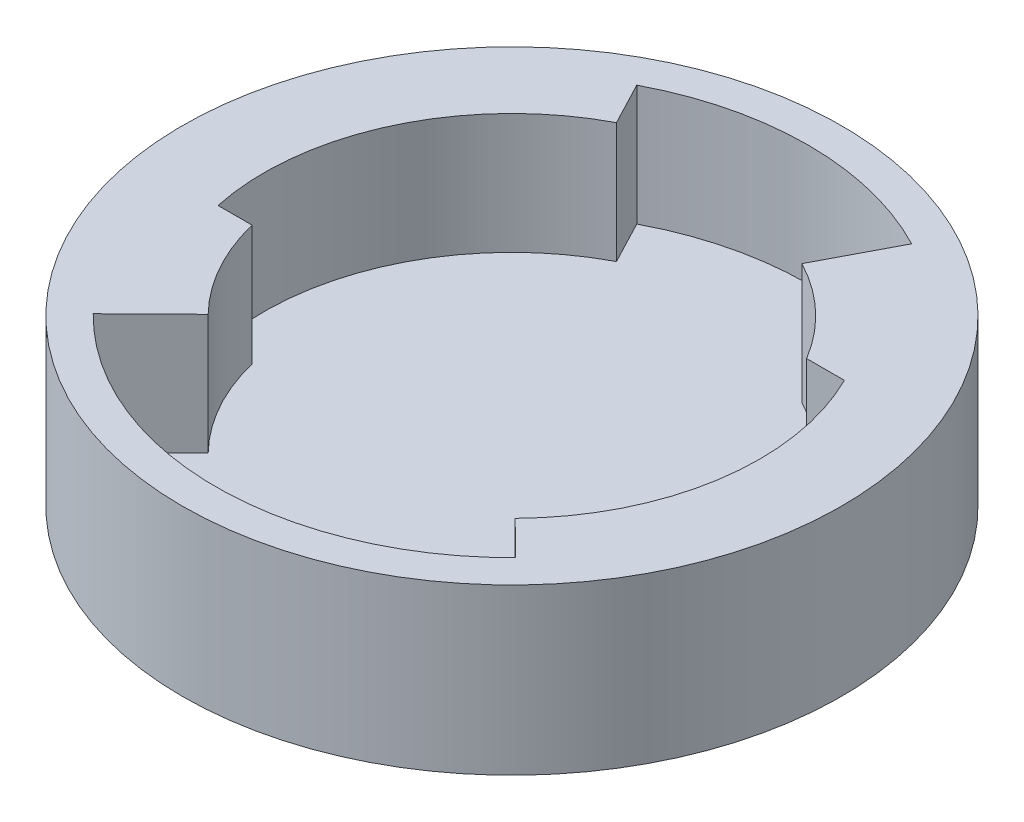
ISO-10303-21;
HEADER;
FILE_DESCRIPTION(('STEP AP214'),'2;1');
FILE_NAME('part.step','',(''),(''),'','','');
FILE_SCHEMA(('AUTOMOTIVE_DESIGN { 1 0 10303 214 1 1 1 1 }'));
ENDSEC;
DATA;
#1=APPLICATION_CONTEXT('core data for automotive mechanical design processes');
#2=APPLICATION_PROTOCOL_DEFINITION('international standard','automotive_design',2000,#1);
#3=PRODUCT_CONTEXT('',#1,'mechanical');
#4=PRODUCT('Part','Part','',(#3));
#5=PRODUCT_RELATED_PRODUCT_CATEGORY('part','',(#4));
#6=PRODUCT_DEFINITION_FORMATION('','',#4);
#7=PRODUCT_DEFINITION_CONTEXT('part definition',#1,'design');
#8=PRODUCT_DEFINITION('design','',#6,#7);
#9=PRODUCT_DEFINITION_SHAPE('','',#8);
#10=(LENGTH_UNIT() NAMED_UNIT(*) SI_UNIT(.MILLI.,.METRE.));
#11=(NAMED_UNIT(*) PLANE_ANGLE_UNIT() SI_UNIT($,.RADIAN.));
#12=(NAMED_UNIT(*) SI_UNIT($,.STERADIAN.) SOLID_ANGLE_UNIT());
#13=UNCERTAINTY_MEASURE_WITH_UNIT(LENGTH_MEASURE(1.E-05),#10,'distance_accuracy_value','');
#14=(GEOMETRIC_REPRESENTATION_CONTEXT(3) GLOBAL_UNCERTAINTY_ASSIGNED_CONTEXT((#13)) GLOBAL_UNIT_ASSIGNED_CONTEXT((#10,
#11,#12)) REPRESENTATION_CONTEXT('',''));
#15=CARTESIAN_POINT('',(0.,0.,0.));
#16=DIRECTION('',(0.,0.,1.));
#17=DIRECTION('',(1.,0.,0.));
#18=AXIS2_PLACEMENT_3D('',#15,#16,#17);
#19=CARTESIAN_POINT('',(0.,-25.,0.));
#20=DIRECTION('',(0.,1.,0.));
#21=DIRECTION('',(0.,0.,1.));
#22=AXIS2_PLACEMENT_3D('',#19,#20,#21);
#23=CYLINDRICAL_SURFACE('',#22,50.);
#24=CARTESIAN_POINT('',(0.,-25.,0.));
#25=DIRECTION('',(0.,1.,0.));
#26=DIRECTION('',(0.,0.,1.));
#27=AXIS2_PLACEMENT_3D('',#24,#25,#26);
#28=CIRCLE('',#27,50.);
#29=CARTESIAN_POINT('',(0.,-25.,50.));
#30=VERTEX_POINT('',#29);
#31=EDGE_CURVE('E11',#30,#30,#28,.T.);
#32=ORIENTED_EDGE('',*,*,#31,.T.);
#33=EDGE_LOOP('',(#32));
#34=FACE_BOUND('',#33,.T.);
#35=CARTESIAN_POINT('',(0.,0.,0.));
#36=DIRECTION('',(0.,1.,0.));
#37=DIRECTION('',(0.,0.,1.));
#38=AXIS2_PLACEMENT_3D('',#35,#36,#37);
#39=CIRCLE('',#38,50.);
#40=CARTESIAN_POINT('',(0.,0.,50.));
#41=VERTEX_POINT('',#40);
#42=EDGE_CURVE('E40',#41,#41,#39,.T.);
#43=ORIENTED_EDGE('',*,*,#42,.F.);
#44=EDGE_LOOP('',(#43));
#45=FACE_BOUND('',#44,.T.);
#46=ADVANCED_FACE('F37',(#34,#45),#23,.T.);
#47=CARTESIAN_POINT('',(0.,-25.,0.));
#48=DIRECTION('',(0.,1.,0.));
#49=DIRECTION('',(0.,0.,1.));
#50=AXIS2_PLACEMENT_3D('',#47,#48,#49);
#51=PLANE('',#50);
#52=ORIENTED_EDGE('',*,*,#31,.F.);
#53=EDGE_LOOP('',(#52));
#54=FACE_BOUND('',#53,.T.);
#55=ADVANCED_FACE('F261',(#54),#51,.F.);
#56=CARTESIAN_POINT('',(0.,0.,0.));
#57=DIRECTION('',(0.,1.,0.));
#58=DIRECTION('',(0.,0.,1.));
#59=AXIS2_PLACEMENT_3D('',#56,#57,#58);
#60=PLANE('',#59);
#61=CARTESIAN_POINT('',(0.,0.,0.));
#62=DIRECTION('',(0.,1.,0.));
#63=DIRECTION('',(0.,0.,-1.));
#64=AXIS2_PLACEMENT_3D('',#61,#62,#63);
#65=CIRCLE('',#64,44.92);
#66=CARTESIAN_POINT('',(20.85,0.,-39.7879868804643));
#67=VERTEX_POINT('',#66);
#68=CARTESIAN_POINT('',(-20.85,0.,-39.7879868804643));
#69=VERTEX_POINT('',#68);
#70=EDGE_CURVE('E51',#67,#69,#65,.T.);
#71=ORIENTED_EDGE('',*,*,#70,.F.);
#72=DIRECTION('',(0.464158504007124,0.,-0.885752156733399));
#73=VECTOR('',#72,1.);
#74=CARTESIAN_POINT('',(20.85,0.,-39.7879868804643));
#75=LINE('',#74,#73);
#76=CARTESIAN_POINT('',(15.1265545049854,0.,-28.8659545415342));
#77=VERTEX_POINT('',#76);
#78=EDGE_CURVE('E188',#77,#67,#75,.T.);
#79=ORIENTED_EDGE('',*,*,#78,.F.);
#80=CARTESIAN_POINT('',(0.,0.,0.));
#81=DIRECTION('',(0.,1.,0.));
#82=DIRECTION('',(0.,0.,-1.));
#83=AXIS2_PLACEMENT_3D('',#80,#81,#82);
#84=CIRCLE('',#83,32.5892004011485);
#85=CARTESIAN_POINT('',(27.9544244429238,0.,-16.7513025419243));
#86=VERTEX_POINT('',#85);
#87=EDGE_CURVE('E186',#86,#77,#84,.T.);
#88=ORIENTED_EDGE('',*,*,#87,.F.);
#89=DIRECTION('',(-1.,0.,0.));
#90=VECTOR('',#89,1.);
#91=CARTESIAN_POINT('',(27.9544244429238,0.,-16.7513025419243));
#92=LINE('',#91,#90);
#93=CARTESIAN_POINT('',(33.6846888533785,0.,-16.7513025419243));
#94=VERTEX_POINT('',#93);
#95=EDGE_CURVE('E135',#94,#86,#92,.T.);
#96=ORIENTED_EDGE('',*,*,#95,.F.);
#97=CARTESIAN_POINT('',(0.,0.,0.));
#98=DIRECTION('',(0.,1.,0.));
#99=DIRECTION('',(0.,0.,1.));
#100=AXIS2_PLACEMENT_3D('',#97,#98,#99);
#101=CIRCLE('',#100,37.62);
#102=CARTESIAN_POINT('',(26.841518254675,0.,26.3590079059124));
#103=VERTEX_POINT('',#102);
#104=EDGE_CURVE('E182',#103,#94,#101,.T.);
#105=ORIENTED_EDGE('',*,*,#104,.F.);
#106=DIRECTION('',(-0.713490650044523,0.,-0.700664750290068));
#107=VECTOR('',#106,1.);
#108=CARTESIAN_POINT('',(32.05,0.,31.4738605830299));
#109=LINE('',#108,#107);
#110=CARTESIAN_POINT('',(32.05,0.,31.4738605830299));
#111=VERTEX_POINT('',#110);
#112=EDGE_CURVE('E179',#111,#103,#109,.T.);
#113=ORIENTED_EDGE('',*,*,#112,.F.);
#114=CARTESIAN_POINT('',(0.,0.,0.));
#115=DIRECTION('',(0.,1.,0.));
#116=DIRECTION('',(0.,0.,-1.));
#117=AXIS2_PLACEMENT_3D('',#114,#115,#116);
#118=CIRCLE('',#117,44.92);
#119=CARTESIAN_POINT('',(-32.05,0.,31.4738605830299));
#120=VERTEX_POINT('',#119);
#121=EDGE_CURVE('E176',#120,#111,#118,.T.);
#122=ORIENTED_EDGE('',*,*,#121,.F.);
#123=DIRECTION('',(-0.713490650044523,0.,0.700664750290068));
#124=VECTOR('',#123,1.);
#125=CARTESIAN_POINT('',(-32.05,0.,31.4738605830299));
#126=LINE('',#125,#124);
#127=CARTESIAN_POINT('',(-23.2520897786466,0.,22.8341039612237));
#128=VERTEX_POINT('',#127);
#129=EDGE_CURVE('E173',#128,#120,#126,.T.);
#130=ORIENTED_EDGE('',*,*,#129,.F.);
#131=CARTESIAN_POINT('',(6.31786289950753E-12,0.,-3.52669282666085E-12));
#132=DIRECTION('',(0.,1.,0.));
#133=DIRECTION('',(0.,0.,-1.));
#134=AXIS2_PLACEMENT_3D('',#131,#132,#133);
#135=CIRCLE('',#134,32.5892004011554);
#136=CARTESIAN_POINT('',(-31.6453479378877,0.,7.78639433089828));
#137=VERTEX_POINT('',#136);
#138=EDGE_CURVE('E170',#137,#128,#135,.T.);
#139=ORIENTED_EDGE('',*,*,#138,.F.);
#140=DIRECTION('',(1.,0.,0.));
#141=VECTOR('',#140,1.);
#142=CARTESIAN_POINT('',(-36.8053863357492,0.,7.78639433089828));
#143=LINE('',#142,#141);
#144=CARTESIAN_POINT('',(-36.8053863357492,0.,7.78639433089827));
#145=VERTEX_POINT('',#144);
#146=EDGE_CURVE('E167',#145,#137,#143,.T.);
#147=ORIENTED_EDGE('',*,*,#146,.F.);
#148=CARTESIAN_POINT('',(0.,0.,0.));
#149=DIRECTION('',(0.,1.,0.));
#150=DIRECTION('',(0.,0.,1.));
#151=AXIS2_PLACEMENT_3D('',#148,#149,#150);
#152=CIRCLE('',#151,37.62);
#153=CARTESIAN_POINT('',(-17.461642920748,0.,-33.3219961363105));
#154=VERTEX_POINT('',#153);
#155=EDGE_CURVE('E164',#154,#145,#152,.T.);
#156=ORIENTED_EDGE('',*,*,#155,.F.);
#157=DIRECTION('',(0.464158504007124,0.,0.8857521567334));
#158=VECTOR('',#157,1.);
#159=CARTESIAN_POINT('',(-20.85,0.,-39.7879868804643));
#160=LINE('',#159,#158);
#161=EDGE_CURVE('E161',#69,#154,#160,.T.);
#162=ORIENTED_EDGE('',*,*,#161,.F.);
#163=EDGE_LOOP('',(#71,#79,#88,#96,#105,#113,#122,#130,#139,#147,#156,#162));
#164=FACE_BOUND('',#163,.T.);
#165=ORIENTED_EDGE('',*,*,#42,.T.);
#166=EDGE_LOOP('',(#165));
#167=FACE_BOUND('',#166,.T.);
#168=ADVANCED_FACE('F215',(#164,#167),#60,.T.);
#169=CARTESIAN_POINT('',(0.,-18.25,0.));
#170=DIRECTION('',(0.,1.,0.));
#171=DIRECTION('',(0.,0.,1.));
#172=AXIS2_PLACEMENT_3D('',#169,#170,#171);
#173=CYLINDRICAL_SURFACE('',#172,44.92);
#174=ORIENTED_EDGE('',*,*,#70,.T.);
#175=DIRECTION('',(0.,1.,0.));
#176=VECTOR('',#175,1.);
#177=CARTESIAN_POINT('',(-20.85,-18.25,-39.7879868804643));
#178=LINE('',#177,#176);
#179=CARTESIAN_POINT('',(-20.85,-18.25,-39.7879868804643));
#180=VERTEX_POINT('',#179);
#181=EDGE_CURVE('E99',#180,#69,#178,.T.);
#182=ORIENTED_EDGE('',*,*,#181,.F.);
#183=CARTESIAN_POINT('',(0.,-18.25,0.));
#184=DIRECTION('',(0.,1.,0.));
#185=DIRECTION('',(0.,0.,-1.));
#186=AXIS2_PLACEMENT_3D('',#183,#184,#185);
#187=CIRCLE('',#186,44.92);
#188=CARTESIAN_POINT('',(20.85,-18.25,-39.7879868804643));
#189=VERTEX_POINT('',#188);
#190=EDGE_CURVE('E190',#189,#180,#187,.T.);
#191=ORIENTED_EDGE('',*,*,#190,.F.);
#192=DIRECTION('',(0.,1.,0.));
#193=VECTOR('',#192,1.);
#194=CARTESIAN_POINT('',(20.85,-18.25,-39.7879868804643));
#195=LINE('',#194,#193);
#196=EDGE_CURVE('E59',#189,#67,#195,.T.);
#197=ORIENTED_EDGE('',*,*,#196,.T.);
#198=EDGE_LOOP('',(#174,#182,#191,#197));
#199=FACE_BOUND('',#198,.T.);
#200=ADVANCED_FACE('F251',(#199),#173,.F.);
#201=CARTESIAN_POINT('',(20.85,-18.25,-39.7879868804643));
#202=DIRECTION('',(0.885752156733399,0.,0.464158504007124));
#203=DIRECTION('',(0.464158504007124,0.,-0.885752156733399));
#204=AXIS2_PLACEMENT_3D('',#201,#202,#203);
#205=PLANE('',#204);
#206=ORIENTED_EDGE('',*,*,#78,.T.);
#207=ORIENTED_EDGE('',*,*,#196,.F.);
#208=DIRECTION('',(0.464158504007124,0.,-0.885752156733399));
#209=VECTOR('',#208,1.);
#210=CARTESIAN_POINT('',(20.85,-18.25,-39.7879868804643));
#211=LINE('',#210,#209);
#212=CARTESIAN_POINT('',(15.1265545049854,-18.25,-28.8659545415342));
#213=VERTEX_POINT('',#212);
#214=EDGE_CURVE('E147',#213,#189,#211,.T.);
#215=ORIENTED_EDGE('',*,*,#214,.F.);
#216=DIRECTION('',(0.,1.,0.));
#217=VECTOR('',#216,1.);
#218=CARTESIAN_POINT('',(15.1265545049854,-18.25,-28.8659545415342));
#219=LINE('',#218,#217);
#220=EDGE_CURVE('E139',#213,#77,#219,.T.);
#221=ORIENTED_EDGE('',*,*,#220,.T.);
#222=EDGE_LOOP('',(#206,#207,#215,#221));
#223=FACE_BOUND('',#222,.T.);
#224=ADVANCED_FACE('F249',(#223),#205,.F.);
#225=CARTESIAN_POINT('',(0.,-18.25,0.));
#226=DIRECTION('',(0.,1.,0.));
#227=DIRECTION('',(0.,0.,1.));
#228=AXIS2_PLACEMENT_3D('',#225,#226,#227);
#229=CYLINDRICAL_SURFACE('',#228,32.5892004011485);
#230=ORIENTED_EDGE('',*,*,#87,.T.);
#231=ORIENTED_EDGE('',*,*,#220,.F.);
#232=CARTESIAN_POINT('',(0.,-18.25,0.));
#233=DIRECTION('',(0.,1.,0.));
#234=DIRECTION('',(0.,0.,-1.));
#235=AXIS2_PLACEMENT_3D('',#232,#233,#234);
#236=CIRCLE('',#235,32.5892004011485);
#237=CARTESIAN_POINT('',(27.9544244429238,-18.25,-16.7513025419243));
#238=VERTEX_POINT('',#237);
#239=EDGE_CURVE('E143',#238,#213,#236,.T.);
#240=ORIENTED_EDGE('',*,*,#239,.F.);
#241=DIRECTION('',(0.,1.,0.));
#242=VECTOR('',#241,1.);
#243=CARTESIAN_POINT('',(27.9544244429238,-18.25,-16.7513025419243));
#244=LINE('',#243,#242);
#245=EDGE_CURVE('E128',#238,#86,#244,.T.);
#246=ORIENTED_EDGE('',*,*,#245,.T.);
#247=EDGE_LOOP('',(#230,#231,#240,#246));
#248=FACE_BOUND('',#247,.T.);
#249=ADVANCED_FACE('F144',(#248),#229,.F.);
#250=CARTESIAN_POINT('',(27.9544244429238,-18.25,-16.7513025419243));
#251=DIRECTION('',(0.,0.,-1.));
#252=DIRECTION('',(-1.,0.,0.));
#253=AXIS2_PLACEMENT_3D('',#250,#251,#252);
#254=PLANE('',#253);
#255=ORIENTED_EDGE('',*,*,#95,.T.);
#256=ORIENTED_EDGE('',*,*,#245,.F.);
#257=DIRECTION('',(-1.,0.,0.));
#258=VECTOR('',#257,1.);
#259=CARTESIAN_POINT('',(27.9544244429238,-18.25,-16.7513025419243));
#260=LINE('',#259,#258);
#261=CARTESIAN_POINT('',(33.6846888533785,-18.25,-16.7513025419243));
#262=VERTEX_POINT('',#261);
#263=EDGE_CURVE('E132',#262,#238,#260,.T.);
#264=ORIENTED_EDGE('',*,*,#263,.F.);
#265=DIRECTION('',(0.,1.,0.));
#266=VECTOR('',#265,1.);
#267=CARTESIAN_POINT('',(33.6846888533785,-18.25,-16.7513025419243));
#268=LINE('',#267,#266);
#269=EDGE_CURVE('E140',#262,#94,#268,.T.);
#270=ORIENTED_EDGE('',*,*,#269,.T.);
#271=EDGE_LOOP('',(#255,#256,#264,#270));
#272=FACE_BOUND('',#271,.T.);
#273=ADVANCED_FACE('F130',(#272),#254,.F.);
#274=CARTESIAN_POINT('',(0.,-18.25,0.));
#275=DIRECTION('',(0.,1.,0.));
#276=DIRECTION('',(0.,0.,1.));
#277=AXIS2_PLACEMENT_3D('',#274,#275,#276);
#278=CYLINDRICAL_SURFACE('',#277,37.62);
#279=ORIENTED_EDGE('',*,*,#104,.T.);
#280=ORIENTED_EDGE('',*,*,#269,.F.);
#281=CARTESIAN_POINT('',(0.,-18.25,0.));
#282=DIRECTION('',(0.,1.,0.));
#283=DIRECTION('',(0.,0.,1.));
#284=AXIS2_PLACEMENT_3D('',#281,#282,#283);
#285=CIRCLE('',#284,37.62);
#286=CARTESIAN_POINT('',(26.841518254675,-18.25,26.3590079059124));
#287=VERTEX_POINT('',#286);
#288=EDGE_CURVE('E153',#287,#262,#285,.T.);
#289=ORIENTED_EDGE('',*,*,#288,.F.);
#290=DIRECTION('',(0.,1.,0.));
#291=VECTOR('',#290,1.);
#292=CARTESIAN_POINT('',(26.841518254675,-18.25,26.3590079059124));
#293=LINE('',#292,#291);
#294=EDGE_CURVE('E194',#287,#103,#293,.T.);
#295=ORIENTED_EDGE('',*,*,#294,.T.);
#296=EDGE_LOOP('',(#279,#280,#289,#295));
#297=FACE_BOUND('',#296,.T.);
#298=ADVANCED_FACE('F248',(#297),#278,.F.);
#299=CARTESIAN_POINT('',(32.05,-18.25,31.4738605830299));
#300=DIRECTION('',(0.700664750290069,0.,-0.713490650044523));
#301=DIRECTION('',(-0.713490650044523,0.,-0.700664750290069));
#302=AXIS2_PLACEMENT_3D('',#299,#300,#301);
#303=PLANE('',#302);
#304=ORIENTED_EDGE('',*,*,#112,.T.);
#305=ORIENTED_EDGE('',*,*,#294,.F.);
#306=DIRECTION('',(-0.713490650044523,0.,-0.700664750290068));
#307=VECTOR('',#306,1.);
#308=CARTESIAN_POINT('',(32.05,-18.25,31.4738605830299));
#309=LINE('',#308,#307);
#310=CARTESIAN_POINT('',(32.05,-18.25,31.4738605830299));
#311=VERTEX_POINT('',#310);
#312=EDGE_CURVE('E155',#311,#287,#309,.T.);
#313=ORIENTED_EDGE('',*,*,#312,.F.);
#314=DIRECTION('',(0.,1.,0.));
#315=VECTOR('',#314,1.);
#316=CARTESIAN_POINT('',(32.05,-18.25,31.4738605830299));
#317=LINE('',#316,#315);
#318=EDGE_CURVE('E196',#311,#111,#317,.T.);
#319=ORIENTED_EDGE('',*,*,#318,.T.);
#320=EDGE_LOOP('',(#304,#305,#313,#319));
#321=FACE_BOUND('',#320,.T.);
#322=ADVANCED_FACE('F244',(#321),#303,.F.);
#323=CARTESIAN_POINT('',(0.,-18.25,0.));
#324=DIRECTION('',(0.,1.,0.));
#325=DIRECTION('',(0.,0.,1.));
#326=AXIS2_PLACEMENT_3D('',#323,#324,#325);
#327=CYLINDRICAL_SURFACE('',#326,44.92);
#328=ORIENTED_EDGE('',*,*,#121,.T.);
#329=ORIENTED_EDGE('',*,*,#318,.F.);
#330=CARTESIAN_POINT('',(0.,-18.25,0.));
#331=DIRECTION('',(0.,1.,0.));
#332=DIRECTION('',(0.,0.,-1.));
#333=AXIS2_PLACEMENT_3D('',#330,#331,#332);
#334=CIRCLE('',#333,44.92);
#335=CARTESIAN_POINT('',(-32.05,-18.25,31.4738605830299));
#336=VERTEX_POINT('',#335);
#337=EDGE_CURVE('E239',#336,#311,#334,.T.);
#338=ORIENTED_EDGE('',*,*,#337,.F.);
#339=DIRECTION('',(0.,1.,0.));
#340=VECTOR('',#339,1.);
#341=CARTESIAN_POINT('',(-32.05,-18.25,31.4738605830299));
#342=LINE('',#341,#340);
#343=EDGE_CURVE('E198',#336,#120,#342,.T.);
#344=ORIENTED_EDGE('',*,*,#343,.T.);
#345=EDGE_LOOP('',(#328,#329,#338,#344));
#346=FACE_BOUND('',#345,.T.);
#347=ADVANCED_FACE('F291',(#346),#327,.F.);
#348=CARTESIAN_POINT('',(-32.05,-18.25,31.4738605830299));
#349=DIRECTION('',(-0.700664750290068,0.,-0.713490650044523));
#350=DIRECTION('',(-0.713490650044523,0.,0.700664750290068));
#351=AXIS2_PLACEMENT_3D('',#348,#349,#350);
#352=PLANE('',#351);
#353=ORIENTED_EDGE('',*,*,#129,.T.);
#354=ORIENTED_EDGE('',*,*,#343,.F.);
#355=DIRECTION('',(-0.713490650044523,0.,0.700664750290068));
#356=VECTOR('',#355,1.);
#357=CARTESIAN_POINT('',(-32.05,-18.25,31.4738605830299));
#358=LINE('',#357,#356);
#359=CARTESIAN_POINT('',(-23.2520897786466,-18.25,22.8341039612237));
#360=VERTEX_POINT('',#359);
#361=EDGE_CURVE('E236',#360,#336,#358,.T.);
#362=ORIENTED_EDGE('',*,*,#361,.F.);
#363=DIRECTION('',(0.,1.,0.));
#364=VECTOR('',#363,1.);
#365=CARTESIAN_POINT('',(-23.2520897786466,-18.25,22.8341039612237));
#366=LINE('',#365,#364);
#367=EDGE_CURVE('E200',#360,#128,#366,.T.);
#368=ORIENTED_EDGE('',*,*,#367,.T.);
#369=EDGE_LOOP('',(#353,#354,#362,#368));
#370=FACE_BOUND('',#369,.T.);
#371=ADVANCED_FACE('F287',(#370),#352,.F.);
#372=CARTESIAN_POINT('',(6.31786289950753E-12,-18.25,-3.52669282666085E-12));
#373=DIRECTION('',(0.,1.,0.));
#374=DIRECTION('',(0.,0.,1.));
#375=AXIS2_PLACEMENT_3D('',#372,#373,#374);
#376=CYLINDRICAL_SURFACE('',#375,32.5892004011554);
#377=ORIENTED_EDGE('',*,*,#138,.T.);
#378=ORIENTED_EDGE('',*,*,#367,.F.);
#379=CARTESIAN_POINT('',(6.31786289950753E-12,-18.25,-3.52669282666085E-12));
#380=DIRECTION('',(0.,1.,0.));
#381=DIRECTION('',(0.,0.,-1.));
#382=AXIS2_PLACEMENT_3D('',#379,#380,#381);
#383=CIRCLE('',#382,32.5892004011554);
#384=CARTESIAN_POINT('',(-31.6453479378877,-18.25,7.78639433089828));
#385=VERTEX_POINT('',#384);
#386=EDGE_CURVE('E233',#385,#360,#383,.T.);
#387=ORIENTED_EDGE('',*,*,#386,.F.);
#388=DIRECTION('',(0.,1.,0.));
#389=VECTOR('',#388,1.);
#390=CARTESIAN_POINT('',(-31.6453479378877,-18.25,7.78639433089828));
#391=LINE('',#390,#389);
#392=EDGE_CURVE('E202',#385,#137,#391,.T.);
#393=ORIENTED_EDGE('',*,*,#392,.T.);
#394=EDGE_LOOP('',(#377,#378,#387,#393));
#395=FACE_BOUND('',#394,.T.);
#396=ADVANCED_FACE('F283',(#395),#376,.F.);
#397=CARTESIAN_POINT('',(-36.8053863357492,-18.25,7.78639433089828));
#398=DIRECTION('',(0.,0.,1.));
#399=DIRECTION('',(1.,0.,0.));
#400=AXIS2_PLACEMENT_3D('',#397,#398,#399);
#401=PLANE('',#400);
#402=ORIENTED_EDGE('',*,*,#146,.T.);
#403=ORIENTED_EDGE('',*,*,#392,.F.);
#404=DIRECTION('',(1.,0.,0.));
#405=VECTOR('',#404,1.);
#406=CARTESIAN_POINT('',(-36.8053863357492,-18.25,7.78639433089828));
#407=LINE('',#406,#405);
#408=CARTESIAN_POINT('',(-36.8053863357492,-18.25,7.78639433089827));
#409=VERTEX_POINT('',#408);
#410=EDGE_CURVE('E227',#409,#385,#407,.T.);
#411=ORIENTED_EDGE('',*,*,#410,.F.);
#412=DIRECTION('',(0.,1.,0.));
#413=VECTOR('',#412,1.);
#414=CARTESIAN_POINT('',(-36.8053863357492,-18.25,7.78639433089827));
#415=LINE('',#414,#413);
#416=EDGE_CURVE('E204',#409,#145,#415,.T.);
#417=ORIENTED_EDGE('',*,*,#416,.T.);
#418=EDGE_LOOP('',(#402,#403,#411,#417));
#419=FACE_BOUND('',#418,.T.);
#420=ADVANCED_FACE('F280',(#419),#401,.F.);
#421=CARTESIAN_POINT('',(0.,-18.25,0.));
#422=DIRECTION('',(0.,1.,0.));
#423=DIRECTION('',(0.,0.,1.));
#424=AXIS2_PLACEMENT_3D('',#421,#422,#423);
#425=CYLINDRICAL_SURFACE('',#424,37.62);
#426=ORIENTED_EDGE('',*,*,#155,.T.);
#427=ORIENTED_EDGE('',*,*,#416,.F.);
#428=CARTESIAN_POINT('',(0.,-18.25,0.));
#429=DIRECTION('',(0.,1.,0.));
#430=DIRECTION('',(0.,0.,1.));
#431=AXIS2_PLACEMENT_3D('',#428,#429,#430);
#432=CIRCLE('',#431,37.62);
#433=CARTESIAN_POINT('',(-17.461642920748,-18.25,-33.3219961363105));
#434=VERTEX_POINT('',#433);
#435=EDGE_CURVE('E225',#434,#409,#432,.T.);
#436=ORIENTED_EDGE('',*,*,#435,.F.);
#437=DIRECTION('',(0.,1.,0.));
#438=VECTOR('',#437,1.);
#439=CARTESIAN_POINT('',(-17.461642920748,-18.25,-33.3219961363105));
#440=LINE('',#439,#438);
#441=EDGE_CURVE('E206',#434,#154,#440,.T.);
#442=ORIENTED_EDGE('',*,*,#441,.T.);
#443=EDGE_LOOP('',(#426,#427,#436,#442));
#444=FACE_BOUND('',#443,.T.);
#445=ADVANCED_FACE('F221',(#444),#425,.F.);
#446=CARTESIAN_POINT('',(-20.85,-18.25,-39.7879868804643));
#447=DIRECTION('',(-0.885752156733399,0.,0.464158504007124));
#448=DIRECTION('',(0.464158504007124,0.,0.8857521567334));
#449=AXIS2_PLACEMENT_3D('',#446,#447,#448);
#450=PLANE('',#449);
#451=ORIENTED_EDGE('',*,*,#161,.T.);
#452=ORIENTED_EDGE('',*,*,#441,.F.);
#453=DIRECTION('',(0.464158504007124,0.,0.8857521567334));
#454=VECTOR('',#453,1.);
#455=CARTESIAN_POINT('',(-20.85,-18.25,-39.7879868804643));
#456=LINE('',#455,#454);
#457=EDGE_CURVE('E213',#180,#434,#456,.T.);
#458=ORIENTED_EDGE('',*,*,#457,.F.);
#459=ORIENTED_EDGE('',*,*,#181,.T.);
#460=EDGE_LOOP('',(#451,#452,#458,#459));
#461=FACE_BOUND('',#460,.T.);
#462=ADVANCED_FACE('F210',(#461),#450,.F.);
#463=CARTESIAN_POINT('',(0.,-18.25,0.));
#464=DIRECTION('',(0.,-1.,0.));
#465=DIRECTION('',(0.,0.,-1.));
#466=AXIS2_PLACEMENT_3D('',#463,#464,#465);
#467=PLANE('',#466);
#468=ORIENTED_EDGE('',*,*,#190,.T.);
#469=ORIENTED_EDGE('',*,*,#457,.T.);
#470=ORIENTED_EDGE('',*,*,#435,.T.);
#471=ORIENTED_EDGE('',*,*,#410,.T.);
#472=ORIENTED_EDGE('',*,*,#386,.T.);
#473=ORIENTED_EDGE('',*,*,#361,.T.);
#474=ORIENTED_EDGE('',*,*,#337,.T.);
#475=ORIENTED_EDGE('',*,*,#312,.T.);
#476=ORIENTED_EDGE('',*,*,#288,.T.);
#477=ORIENTED_EDGE('',*,*,#263,.T.);
#478=ORIENTED_EDGE('',*,*,#239,.T.);
#479=ORIENTED_EDGE('',*,*,#214,.T.);
#480=EDGE_LOOP('',(#468,#469,#470,#471,#472,#473,#474,#475,#476,#477,#478,#479));
#481=FACE_BOUND('',#480,.T.);
#482=ADVANCED_FACE('F150',(#481),#467,.F.);
#483=CLOSED_SHELL('',(#46,#55,#168,#200,#224,#249,#273,#298,#322,#347,#371,#396,#420,#445,#462,#482));
#484=MANIFOLD_SOLID_BREP('B2',#483);
#485=ADVANCED_BREP_SHAPE_REPRESENTATION('',(#18,#484),#14);
#486=SHAPE_DEFINITION_REPRESENTATION(#9,#485);
ENDSEC;
END-ISO-10303-21;
